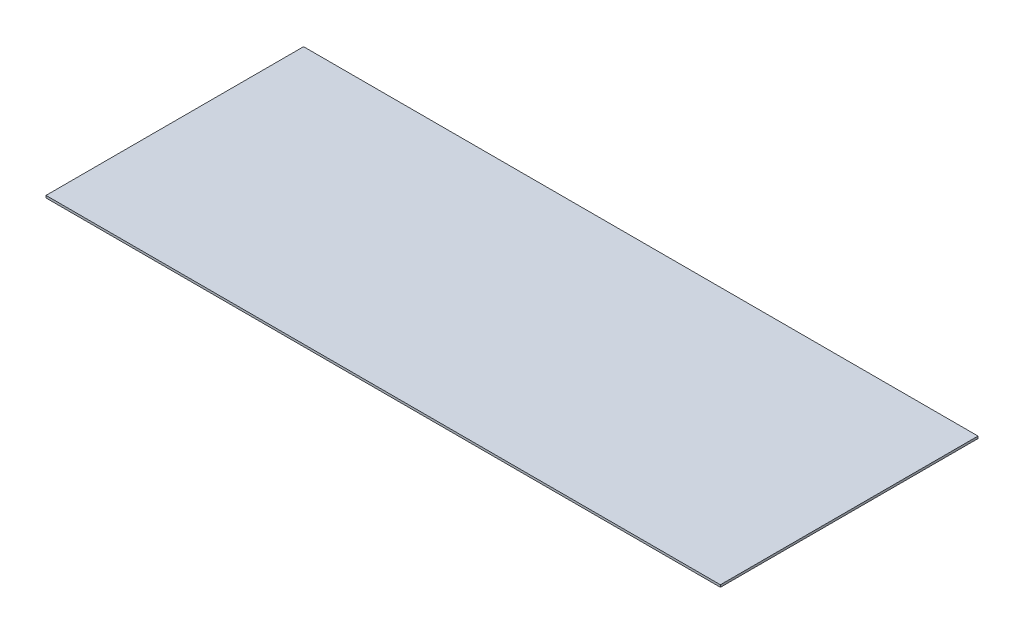
ISO-10303-21;
HEADER;
FILE_DESCRIPTION(('STEP AP214'),'2;1');
FILE_NAME('part.step','',(''),(''),'','','');
FILE_SCHEMA(('AUTOMOTIVE_DESIGN { 1 0 10303 214 1 1 1 1 }'));
ENDSEC;
DATA;
#1=APPLICATION_CONTEXT('core data for automotive mechanical design processes');
#2=APPLICATION_PROTOCOL_DEFINITION('international standard','automotive_design',2000,#1);
#3=PRODUCT_CONTEXT('',#1,'mechanical');
#4=PRODUCT('Part','Part','',(#3));
#5=PRODUCT_RELATED_PRODUCT_CATEGORY('part','',(#4));
#6=PRODUCT_DEFINITION_FORMATION('','',#4);
#7=PRODUCT_DEFINITION_CONTEXT('part definition',#1,'design');
#8=PRODUCT_DEFINITION('design','',#6,#7);
#9=PRODUCT_DEFINITION_SHAPE('','',#8);
#10=(LENGTH_UNIT() NAMED_UNIT(*) SI_UNIT(.MILLI.,.METRE.));
#11=(NAMED_UNIT(*) PLANE_ANGLE_UNIT() SI_UNIT($,.RADIAN.));
#12=(NAMED_UNIT(*) SI_UNIT($,.STERADIAN.) SOLID_ANGLE_UNIT());
#13=UNCERTAINTY_MEASURE_WITH_UNIT(LENGTH_MEASURE(1.E-05),#10,'distance_accuracy_value','');
#14=(GEOMETRIC_REPRESENTATION_CONTEXT(3) GLOBAL_UNCERTAINTY_ASSIGNED_CONTEXT((#13)) GLOBAL_UNIT_ASSIGNED_CONTEXT((#10,
#11,#12)) REPRESENTATION_CONTEXT('',''));
#15=CARTESIAN_POINT('',(0.,0.,0.));
#16=DIRECTION('',(0.,0.,1.));
#17=DIRECTION('',(1.,0.,0.));
#18=AXIS2_PLACEMENT_3D('',#15,#16,#17);
#19=CARTESIAN_POINT('',(-101.776630081975,-1.51892,-51.6194689927257));
#20=DIRECTION('',(-1.,0.,0.));
#21=DIRECTION('',(0.,0.,1.));
#22=AXIS2_PLACEMENT_3D('',#19,#20,#21);
#23=PLANE('',#22);
#24=DIRECTION('',(0.,0.,1.));
#25=VECTOR('',#24,1.);
#26=CARTESIAN_POINT('',(-101.776630081975,0.,-51.6194689927257));
#27=LINE('',#26,#25);
#28=CARTESIAN_POINT('',(-101.776630081975,0.,-51.6194689927257));
#29=VERTEX_POINT('',#28);
#30=CARTESIAN_POINT('',(-101.776630081975,0.,123.005531007274));
#31=VERTEX_POINT('',#30);
#32=EDGE_CURVE('E97',#29,#31,#27,.T.);
#33=ORIENTED_EDGE('',*,*,#32,.F.);
#34=DIRECTION('',(0.,1.,0.));
#35=VECTOR('',#34,1.);
#36=CARTESIAN_POINT('',(-101.776630081975,-1.51892,-51.6194689927257));
#37=LINE('',#36,#35);
#38=CARTESIAN_POINT('',(-101.776630081975,-1.51892,-51.6194689927257));
#39=VERTEX_POINT('',#38);
#40=EDGE_CURVE('E11',#39,#29,#37,.T.);
#41=ORIENTED_EDGE('',*,*,#40,.F.);
#42=DIRECTION('',(0.,0.,1.));
#43=VECTOR('',#42,1.);
#44=CARTESIAN_POINT('',(-101.776630081975,-1.51892,-51.6194689927257));
#45=LINE('',#44,#43);
#46=CARTESIAN_POINT('',(-101.776630081975,-1.51892,123.005531007274));
#47=VERTEX_POINT('',#46);
#48=EDGE_CURVE('E91',#39,#47,#45,.T.);
#49=ORIENTED_EDGE('',*,*,#48,.T.);
#50=DIRECTION('',(0.,1.,0.));
#51=VECTOR('',#50,1.);
#52=CARTESIAN_POINT('',(-101.776630081975,-1.51892,123.005531007274));
#53=LINE('',#52,#51);
#54=EDGE_CURVE('E36',#47,#31,#53,.T.);
#55=ORIENTED_EDGE('',*,*,#54,.T.);
#56=EDGE_LOOP('',(#33,#41,#49,#55));
#57=FACE_BOUND('',#56,.T.);
#58=ADVANCED_FACE('F33',(#57),#23,.T.);
#59=CARTESIAN_POINT('',(-101.776630081975,-1.51892,-51.6194689927257));
#60=DIRECTION('',(0.,0.,-1.));
#61=DIRECTION('',(-1.,0.,0.));
#62=AXIS2_PLACEMENT_3D('',#59,#60,#61);
#63=PLANE('',#62);
#64=DIRECTION('',(-1.,0.,0.));
#65=VECTOR('',#64,1.);
#66=CARTESIAN_POINT('',(-101.776630081975,0.,-51.6194689927257));
#67=LINE('',#66,#65);
#68=CARTESIAN_POINT('',(355.423369918025,0.,-51.6194689927257));
#69=VERTEX_POINT('',#68);
#70=EDGE_CURVE('E93',#69,#29,#67,.T.);
#71=ORIENTED_EDGE('',*,*,#70,.F.);
#72=DIRECTION('',(0.,1.,0.));
#73=VECTOR('',#72,1.);
#74=CARTESIAN_POINT('',(355.423369918025,-1.51892,-51.6194689927257));
#75=LINE('',#74,#73);
#76=CARTESIAN_POINT('',(355.423369918025,-1.51892,-51.6194689927257));
#77=VERTEX_POINT('',#76);
#78=EDGE_CURVE('E42',#77,#69,#75,.T.);
#79=ORIENTED_EDGE('',*,*,#78,.F.);
#80=DIRECTION('',(-1.,0.,0.));
#81=VECTOR('',#80,1.);
#82=CARTESIAN_POINT('',(-101.776630081975,-1.51892,-51.6194689927257));
#83=LINE('',#82,#81);
#84=EDGE_CURVE('E88',#77,#39,#83,.T.);
#85=ORIENTED_EDGE('',*,*,#84,.T.);
#86=ORIENTED_EDGE('',*,*,#40,.T.);
#87=EDGE_LOOP('',(#71,#79,#85,#86));
#88=FACE_BOUND('',#87,.T.);
#89=ADVANCED_FACE('F107',(#88),#63,.T.);
#90=CARTESIAN_POINT('',(355.423369918025,-1.51892,-51.6194689927257));
#91=DIRECTION('',(1.,0.,0.));
#92=DIRECTION('',(0.,0.,-1.));
#93=AXIS2_PLACEMENT_3D('',#90,#91,#92);
#94=PLANE('',#93);
#95=DIRECTION('',(0.,0.,-1.));
#96=VECTOR('',#95,1.);
#97=CARTESIAN_POINT('',(355.423369918025,0.,-51.6194689927257));
#98=LINE('',#97,#96);
#99=CARTESIAN_POINT('',(355.423369918025,0.,123.005531007274));
#100=VERTEX_POINT('',#99);
#101=EDGE_CURVE('E83',#100,#69,#98,.T.);
#102=ORIENTED_EDGE('',*,*,#101,.F.);
#103=DIRECTION('',(0.,1.,0.));
#104=VECTOR('',#103,1.);
#105=CARTESIAN_POINT('',(355.423369918025,-1.51892,123.005531007274));
#106=LINE('',#105,#104);
#107=CARTESIAN_POINT('',(355.423369918025,-1.51892,123.005531007274));
#108=VERTEX_POINT('',#107);
#109=EDGE_CURVE('E78',#108,#100,#106,.T.);
#110=ORIENTED_EDGE('',*,*,#109,.F.);
#111=DIRECTION('',(0.,0.,-1.));
#112=VECTOR('',#111,1.);
#113=CARTESIAN_POINT('',(355.423369918025,-1.51892,-51.6194689927257));
#114=LINE('',#113,#112);
#115=EDGE_CURVE('E81',#108,#77,#114,.T.);
#116=ORIENTED_EDGE('',*,*,#115,.T.);
#117=ORIENTED_EDGE('',*,*,#78,.T.);
#118=EDGE_LOOP('',(#102,#110,#116,#117));
#119=FACE_BOUND('',#118,.T.);
#120=ADVANCED_FACE('F80',(#119),#94,.T.);
#121=CARTESIAN_POINT('',(-101.776630081975,-1.51892,123.005531007274));
#122=DIRECTION('',(0.,0.,1.));
#123=DIRECTION('',(1.,0.,0.));
#124=AXIS2_PLACEMENT_3D('',#121,#122,#123);
#125=PLANE('',#124);
#126=DIRECTION('',(1.,0.,0.));
#127=VECTOR('',#126,1.);
#128=CARTESIAN_POINT('',(-101.776630081975,0.,123.005531007274));
#129=LINE('',#128,#127);
#130=EDGE_CURVE('E100',#31,#100,#129,.T.);
#131=ORIENTED_EDGE('',*,*,#130,.F.);
#132=ORIENTED_EDGE('',*,*,#54,.F.);
#133=DIRECTION('',(1.,0.,0.));
#134=VECTOR('',#133,1.);
#135=CARTESIAN_POINT('',(-101.776630081975,-1.51892,123.005531007274));
#136=LINE('',#135,#134);
#137=EDGE_CURVE('E87',#47,#108,#136,.T.);
#138=ORIENTED_EDGE('',*,*,#137,.T.);
#139=ORIENTED_EDGE('',*,*,#109,.T.);
#140=EDGE_LOOP('',(#131,#132,#138,#139));
#141=FACE_BOUND('',#140,.T.);
#142=ADVANCED_FACE('F90',(#141),#125,.T.);
#143=CARTESIAN_POINT('',(-101.776630081975,-1.51892,123.005531007274));
#144=DIRECTION('',(0.,1.,0.));
#145=DIRECTION('',(0.,0.,1.));
#146=AXIS2_PLACEMENT_3D('',#143,#144,#145);
#147=PLANE('',#146);
#148=ORIENTED_EDGE('',*,*,#48,.F.);
#149=ORIENTED_EDGE('',*,*,#84,.F.);
#150=ORIENTED_EDGE('',*,*,#115,.F.);
#151=ORIENTED_EDGE('',*,*,#137,.F.);
#152=EDGE_LOOP('',(#148,#149,#150,#151));
#153=FACE_BOUND('',#152,.T.);
#154=ADVANCED_FACE('F86',(#153),#147,.F.);
#155=CARTESIAN_POINT('',(-101.776630081975,0.,123.005531007274));
#156=DIRECTION('',(0.,1.,0.));
#157=DIRECTION('',(0.,0.,1.));
#158=AXIS2_PLACEMENT_3D('',#155,#156,#157);
#159=PLANE('',#158);
#160=ORIENTED_EDGE('',*,*,#32,.T.);
#161=ORIENTED_EDGE('',*,*,#130,.T.);
#162=ORIENTED_EDGE('',*,*,#101,.T.);
#163=ORIENTED_EDGE('',*,*,#70,.T.);
#164=EDGE_LOOP('',(#160,#161,#162,#163));
#165=FACE_BOUND('',#164,.T.);
#166=ADVANCED_FACE('F106',(#165),#159,.T.);
#167=CLOSED_SHELL('',(#58,#89,#120,#142,#154,#166));
#168=MANIFOLD_SOLID_BREP('B2',#167);
#169=ADVANCED_BREP_SHAPE_REPRESENTATION('',(#18,#168),#14);
#170=SHAPE_DEFINITION_REPRESENTATION(#9,#169);
ENDSEC;
END-ISO-10303-21;
